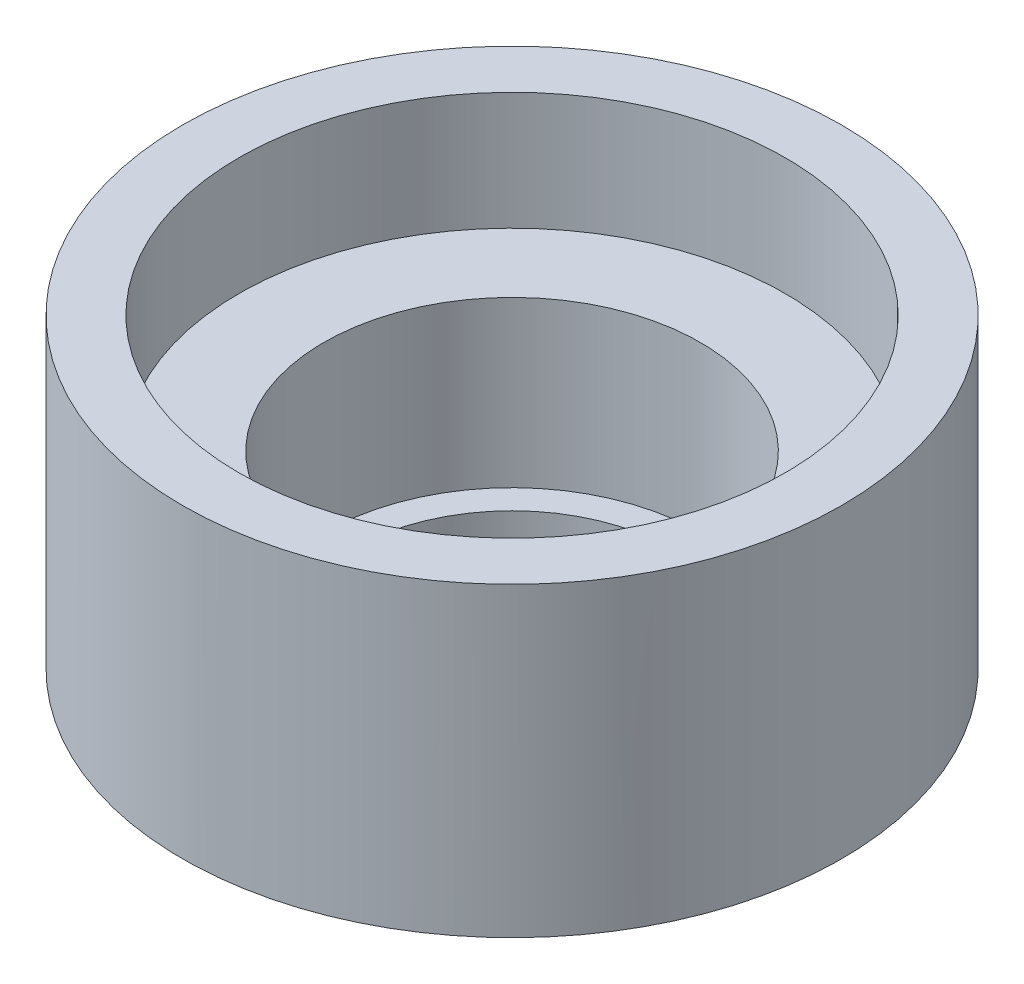
ISO-10303-21;
HEADER;
FILE_DESCRIPTION(('STEP AP214'),'2;1');
FILE_NAME('part.step','',(''),(''),'','','');
FILE_SCHEMA(('AUTOMOTIVE_DESIGN { 1 0 10303 214 1 1 1 1 }'));
ENDSEC;
DATA;
#1=APPLICATION_CONTEXT('core data for automotive mechanical design processes');
#2=APPLICATION_PROTOCOL_DEFINITION('international standard','automotive_design',2000,#1);
#3=PRODUCT_CONTEXT('',#1,'mechanical');
#4=PRODUCT('Part','Part','',(#3));
#5=PRODUCT_RELATED_PRODUCT_CATEGORY('part','',(#4));
#6=PRODUCT_DEFINITION_FORMATION('','',#4);
#7=PRODUCT_DEFINITION_CONTEXT('part definition',#1,'design');
#8=PRODUCT_DEFINITION('design','',#6,#7);
#9=PRODUCT_DEFINITION_SHAPE('','',#8);
#10=(LENGTH_UNIT() NAMED_UNIT(*) SI_UNIT(.MILLI.,.METRE.));
#11=(NAMED_UNIT(*) PLANE_ANGLE_UNIT() SI_UNIT($,.RADIAN.));
#12=(NAMED_UNIT(*) SI_UNIT($,.STERADIAN.) SOLID_ANGLE_UNIT());
#13=UNCERTAINTY_MEASURE_WITH_UNIT(LENGTH_MEASURE(1.E-05),#10,'distance_accuracy_value','');
#14=(GEOMETRIC_REPRESENTATION_CONTEXT(3) GLOBAL_UNCERTAINTY_ASSIGNED_CONTEXT((#13)) GLOBAL_UNIT_ASSIGNED_CONTEXT((#10,
#11,#12)) REPRESENTATION_CONTEXT('',''));
#15=CARTESIAN_POINT('',(0.,0.,0.));
#16=DIRECTION('',(0.,0.,1.));
#17=DIRECTION('',(1.,0.,0.));
#18=AXIS2_PLACEMENT_3D('',#15,#16,#17);
#19=CARTESIAN_POINT('',(0.,-2.25,0.));
#20=DIRECTION('',(0.,1.,0.));
#21=DIRECTION('',(0.,0.,1.));
#22=AXIS2_PLACEMENT_3D('',#19,#20,#21);
#23=CYLINDRICAL_SURFACE('',#22,1.7);
#24=CARTESIAN_POINT('',(0.,0.75,0.));
#25=DIRECTION('',(0.,1.,0.));
#26=DIRECTION('',(0.,0.,1.));
#27=AXIS2_PLACEMENT_3D('',#24,#25,#26);
#28=CIRCLE('',#27,1.7);
#29=CARTESIAN_POINT('',(0.,0.75,1.7));
#30=VERTEX_POINT('',#29);
#31=EDGE_CURVE('E47',#30,#30,#28,.T.);
#32=ORIENTED_EDGE('',*,*,#31,.T.);
#33=EDGE_LOOP('',(#32));
#34=FACE_BOUND('',#33,.T.);
#35=CARTESIAN_POINT('',(0.,0.2,0.));
#36=DIRECTION('',(0.,-1.,0.));
#37=DIRECTION('',(0.,0.,-1.));
#38=AXIS2_PLACEMENT_3D('',#35,#36,#37);
#39=CIRCLE('',#38,1.7);
#40=CARTESIAN_POINT('',(0.,0.2,-1.7));
#41=VERTEX_POINT('',#40);
#42=EDGE_CURVE('E62',#41,#41,#39,.F.);
#43=ORIENTED_EDGE('',*,*,#42,.F.);
#44=EDGE_LOOP('',(#43));
#45=FACE_BOUND('',#44,.T.);
#46=ADVANCED_FACE('F30',(#34,#45),#23,.F.);
#47=CARTESIAN_POINT('',(0.,0.5,0.));
#48=DIRECTION('',(0.,-1.,0.));
#49=DIRECTION('',(0.,0.,-1.));
#50=AXIS2_PLACEMENT_3D('',#47,#48,#49);
#51=CYLINDRICAL_SURFACE('',#50,2.3);
#52=CARTESIAN_POINT('',(0.,0.5,0.));
#53=DIRECTION('',(0.,-1.,0.));
#54=DIRECTION('',(0.,0.,-1.));
#55=AXIS2_PLACEMENT_3D('',#52,#53,#54);
#56=CIRCLE('',#55,2.3);
#57=CARTESIAN_POINT('',(0.,0.5,-2.3));
#58=VERTEX_POINT('',#57);
#59=EDGE_CURVE('E53',#58,#58,#56,.T.);
#60=ORIENTED_EDGE('',*,*,#59,.T.);
#61=EDGE_LOOP('',(#60));
#62=FACE_BOUND('',#61,.T.);
#63=CARTESIAN_POINT('',(0.,0.2,0.));
#64=DIRECTION('',(0.,-1.,0.));
#65=DIRECTION('',(0.,0.,-1.));
#66=AXIS2_PLACEMENT_3D('',#63,#64,#65);
#67=CIRCLE('',#66,2.3);
#68=CARTESIAN_POINT('',(0.,0.2,-2.3));
#69=VERTEX_POINT('',#68);
#70=EDGE_CURVE('E34',#69,#69,#67,.F.);
#71=ORIENTED_EDGE('',*,*,#70,.T.);
#72=EDGE_LOOP('',(#71));
#73=FACE_BOUND('',#72,.T.);
#74=ADVANCED_FACE('F69',(#62,#73),#51,.T.);
#75=CARTESIAN_POINT('',(0.,0.75,0.));
#76=DIRECTION('',(0.,1.,0.));
#77=DIRECTION('',(0.,0.,1.));
#78=AXIS2_PLACEMENT_3D('',#75,#76,#77);
#79=PLANE('',#78);
#80=ORIENTED_EDGE('',*,*,#31,.F.);
#81=EDGE_LOOP('',(#80));
#82=FACE_BOUND('',#81,.T.);
#83=CARTESIAN_POINT('',(0.,0.75,0.));
#84=DIRECTION('',(0.,1.,0.));
#85=DIRECTION('',(0.,0.,1.));
#86=AXIS2_PLACEMENT_3D('',#83,#84,#85);
#87=CIRCLE('',#86,2.);
#88=CARTESIAN_POINT('',(0.,0.75,2.));
#89=VERTEX_POINT('',#88);
#90=EDGE_CURVE('E10',#89,#89,#87,.F.);
#91=ORIENTED_EDGE('',*,*,#90,.F.);
#92=EDGE_LOOP('',(#91));
#93=FACE_BOUND('',#92,.T.);
#94=ADVANCED_FACE('F87',(#82,#93),#79,.T.);
#95=CARTESIAN_POINT('',(0.,3.75,0.));
#96=DIRECTION('',(0.,-1.,0.));
#97=DIRECTION('',(0.,0.,-1.));
#98=AXIS2_PLACEMENT_3D('',#95,#96,#97);
#99=CYLINDRICAL_SURFACE('',#98,3.5);
#100=CARTESIAN_POINT('',(0.,3.75,0.));
#101=DIRECTION('',(0.,1.,0.));
#102=DIRECTION('',(0.,0.,1.));
#103=AXIS2_PLACEMENT_3D('',#100,#101,#102);
#104=CIRCLE('',#103,3.5);
#105=CARTESIAN_POINT('',(0.,3.75,3.5));
#106=VERTEX_POINT('',#105);
#107=EDGE_CURVE('E38',#106,#106,#104,.T.);
#108=ORIENTED_EDGE('',*,*,#107,.F.);
#109=EDGE_LOOP('',(#108));
#110=FACE_BOUND('',#109,.T.);
#111=CARTESIAN_POINT('',(0.,0.5,0.));
#112=DIRECTION('',(0.,-1.,0.));
#113=DIRECTION('',(0.,0.,-1.));
#114=AXIS2_PLACEMENT_3D('',#111,#112,#113);
#115=CIRCLE('',#114,3.5);
#116=CARTESIAN_POINT('',(0.,0.5,-3.5));
#117=VERTEX_POINT('',#116);
#118=EDGE_CURVE('E50',#117,#117,#115,.T.);
#119=ORIENTED_EDGE('',*,*,#118,.F.);
#120=EDGE_LOOP('',(#119));
#121=FACE_BOUND('',#120,.T.);
#122=ADVANCED_FACE('F32',(#110,#121),#99,.T.);
#123=CARTESIAN_POINT('',(0.,3.75,0.));
#124=DIRECTION('',(0.,1.,0.));
#125=DIRECTION('',(0.,0.,1.));
#126=AXIS2_PLACEMENT_3D('',#123,#124,#125);
#127=PLANE('',#126);
#128=CARTESIAN_POINT('',(0.,3.75,0.));
#129=DIRECTION('',(0.,1.,0.));
#130=DIRECTION('',(0.,0.,1.));
#131=AXIS2_PLACEMENT_3D('',#128,#129,#130);
#132=CIRCLE('',#131,2.9);
#133=CARTESIAN_POINT('',(0.,3.75,2.9));
#134=VERTEX_POINT('',#133);
#135=EDGE_CURVE('E42',#134,#134,#132,.T.);
#136=ORIENTED_EDGE('',*,*,#135,.F.);
#137=EDGE_LOOP('',(#136));
#138=FACE_BOUND('',#137,.T.);
#139=ORIENTED_EDGE('',*,*,#107,.T.);
#140=EDGE_LOOP('',(#139));
#141=FACE_BOUND('',#140,.T.);
#142=ADVANCED_FACE('F99',(#138,#141),#127,.T.);
#143=CARTESIAN_POINT('',(0.,0.75,0.));
#144=DIRECTION('',(0.,1.,0.));
#145=DIRECTION('',(0.,0.,1.));
#146=AXIS2_PLACEMENT_3D('',#143,#144,#145);
#147=CYLINDRICAL_SURFACE('',#146,2.9);
#148=CARTESIAN_POINT('',(0.,2.5,0.));
#149=DIRECTION('',(0.,1.,0.));
#150=DIRECTION('',(0.,0.,1.));
#151=AXIS2_PLACEMENT_3D('',#148,#149,#150);
#152=CIRCLE('',#151,2.9);
#153=CARTESIAN_POINT('',(0.,2.5,2.9));
#154=VERTEX_POINT('',#153);
#155=EDGE_CURVE('E56',#154,#154,#152,.T.);
#156=ORIENTED_EDGE('',*,*,#155,.F.);
#157=EDGE_LOOP('',(#156));
#158=FACE_BOUND('',#157,.T.);
#159=ORIENTED_EDGE('',*,*,#135,.T.);
#160=EDGE_LOOP('',(#159));
#161=FACE_BOUND('',#160,.T.);
#162=ADVANCED_FACE('F97',(#158,#161),#147,.F.);
#163=CARTESIAN_POINT('',(0.,0.5,0.));
#164=DIRECTION('',(0.,-1.,0.));
#165=DIRECTION('',(0.,0.,-1.));
#166=AXIS2_PLACEMENT_3D('',#163,#164,#165);
#167=PLANE('',#166);
#168=ORIENTED_EDGE('',*,*,#59,.F.);
#169=EDGE_LOOP('',(#168));
#170=FACE_BOUND('',#169,.T.);
#171=ORIENTED_EDGE('',*,*,#118,.T.);
#172=EDGE_LOOP('',(#171));
#173=FACE_BOUND('',#172,.T.);
#174=ADVANCED_FACE('F93',(#170,#173),#167,.T.);
#175=CARTESIAN_POINT('',(0.,2.5,0.));
#176=DIRECTION('',(0.,1.,0.));
#177=DIRECTION('',(0.,0.,1.));
#178=AXIS2_PLACEMENT_3D('',#175,#176,#177);
#179=PLANE('',#178);
#180=ORIENTED_EDGE('',*,*,#155,.T.);
#181=EDGE_LOOP('',(#180));
#182=FACE_BOUND('',#181,.T.);
#183=CARTESIAN_POINT('',(0.,2.5,0.));
#184=DIRECTION('',(0.,1.,0.));
#185=DIRECTION('',(0.,0.,1.));
#186=AXIS2_PLACEMENT_3D('',#183,#184,#185);
#187=CIRCLE('',#186,2.);
#188=CARTESIAN_POINT('',(0.,2.5,2.));
#189=VERTEX_POINT('',#188);
#190=EDGE_CURVE('E59',#189,#189,#187,.T.);
#191=ORIENTED_EDGE('',*,*,#190,.F.);
#192=EDGE_LOOP('',(#191));
#193=FACE_BOUND('',#192,.T.);
#194=ADVANCED_FACE('F78',(#182,#193),#179,.T.);
#195=CARTESIAN_POINT('',(0.,2.5,0.));
#196=DIRECTION('',(0.,-1.,0.));
#197=DIRECTION('',(0.,0.,-1.));
#198=AXIS2_PLACEMENT_3D('',#195,#196,#197);
#199=CYLINDRICAL_SURFACE('',#198,2.);
#200=ORIENTED_EDGE('',*,*,#190,.T.);
#201=EDGE_LOOP('',(#200));
#202=FACE_BOUND('',#201,.T.);
#203=ORIENTED_EDGE('',*,*,#90,.T.);
#204=EDGE_LOOP('',(#203));
#205=FACE_BOUND('',#204,.T.);
#206=ADVANCED_FACE('F73',(#202,#205),#199,.F.);
#207=CARTESIAN_POINT('',(0.,0.2,0.));
#208=DIRECTION('',(0.,-1.,0.));
#209=DIRECTION('',(0.,0.,-1.));
#210=AXIS2_PLACEMENT_3D('',#207,#208,#209);
#211=PLANE('',#210);
#212=ORIENTED_EDGE('',*,*,#70,.F.);
#213=EDGE_LOOP('',(#212));
#214=FACE_BOUND('',#213,.T.);
#215=ORIENTED_EDGE('',*,*,#42,.T.);
#216=EDGE_LOOP('',(#215));
#217=FACE_BOUND('',#216,.T.);
#218=ADVANCED_FACE('F71',(#214,#217),#211,.T.);
#219=CLOSED_SHELL('',(#46,#74,#94,#122,#142,#162,#174,#194,#206,#218));
#220=MANIFOLD_SOLID_BREP('B2',#219);
#221=ADVANCED_BREP_SHAPE_REPRESENTATION('',(#18,#220),#14);
#222=SHAPE_DEFINITION_REPRESENTATION(#9,#221);
ENDSEC;
END-ISO-10303-21;
